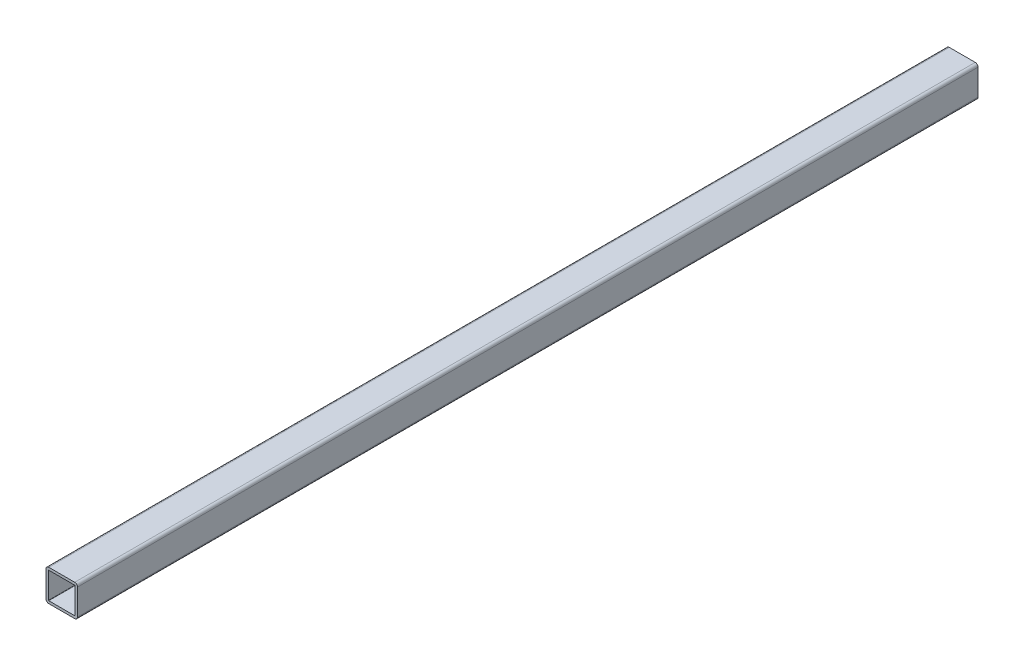
ISO-10303-21;
HEADER;
FILE_DESCRIPTION(('STEP AP214'),'2;1');
FILE_NAME('part.step','',(''),(''),'','','');
FILE_SCHEMA(('AUTOMOTIVE_DESIGN { 1 0 10303 214 1 1 1 1 }'));
ENDSEC;
DATA;
#1=APPLICATION_CONTEXT('core data for automotive mechanical design processes');
#2=APPLICATION_PROTOCOL_DEFINITION('international standard','automotive_design',2000,#1);
#3=PRODUCT_CONTEXT('',#1,'mechanical');
#4=PRODUCT('Part','Part','',(#3));
#5=PRODUCT_RELATED_PRODUCT_CATEGORY('part','',(#4));
#6=PRODUCT_DEFINITION_FORMATION('','',#4);
#7=PRODUCT_DEFINITION_CONTEXT('part definition',#1,'design');
#8=PRODUCT_DEFINITION('design','',#6,#7);
#9=PRODUCT_DEFINITION_SHAPE('','',#8);
#10=(LENGTH_UNIT() NAMED_UNIT(*) SI_UNIT(.MILLI.,.METRE.));
#11=(NAMED_UNIT(*) PLANE_ANGLE_UNIT() SI_UNIT($,.RADIAN.));
#12=(NAMED_UNIT(*) SI_UNIT($,.STERADIAN.) SOLID_ANGLE_UNIT());
#13=UNCERTAINTY_MEASURE_WITH_UNIT(LENGTH_MEASURE(1.E-05),#10,'distance_accuracy_value','');
#14=(GEOMETRIC_REPRESENTATION_CONTEXT(3) GLOBAL_UNCERTAINTY_ASSIGNED_CONTEXT((#13)) GLOBAL_UNIT_ASSIGNED_CONTEXT((#10,
#11,#12)) REPRESENTATION_CONTEXT('',''));
#15=CARTESIAN_POINT('',(0.,0.,0.));
#16=DIRECTION('',(0.,0.,1.));
#17=DIRECTION('',(1.,0.,0.));
#18=AXIS2_PLACEMENT_3D('',#15,#16,#17);
#19=CARTESIAN_POINT('',(-10.3,10.3,-715.));
#20=DIRECTION('',(0.,0.,1.));
#21=DIRECTION('',(1.,0.,0.));
#22=AXIS2_PLACEMENT_3D('',#19,#20,#21);
#23=CYLINDRICAL_SURFACE('',#22,2.2);
#24=CARTESIAN_POINT('',(-10.3,10.3,0.));
#25=DIRECTION('',(0.,0.,-1.));
#26=DIRECTION('',(-1.,0.,0.));
#27=AXIS2_PLACEMENT_3D('',#24,#25,#26);
#28=CIRCLE('',#27,2.2);
#29=CARTESIAN_POINT('',(-12.5,10.3,0.));
#30=VERTEX_POINT('',#29);
#31=CARTESIAN_POINT('',(-10.3,12.5,0.));
#32=VERTEX_POINT('',#31);
#33=EDGE_CURVE('E233',#30,#32,#28,.T.);
#34=ORIENTED_EDGE('',*,*,#33,.T.);
#35=DIRECTION('',(0.,0.,1.));
#36=VECTOR('',#35,1.);
#37=CARTESIAN_POINT('',(-10.3,12.5,-715.));
#38=LINE('',#37,#36);
#39=CARTESIAN_POINT('',(-10.3,12.5,-715.));
#40=VERTEX_POINT('',#39);
#41=EDGE_CURVE('E12',#40,#32,#38,.T.);
#42=ORIENTED_EDGE('',*,*,#41,.F.);
#43=CARTESIAN_POINT('',(-10.3,10.3,-715.));
#44=DIRECTION('',(0.,0.,-1.));
#45=DIRECTION('',(-1.,0.,0.));
#46=AXIS2_PLACEMENT_3D('',#43,#44,#45);
#47=CIRCLE('',#46,2.2);
#48=CARTESIAN_POINT('',(-12.5,10.3,-715.));
#49=VERTEX_POINT('',#48);
#50=EDGE_CURVE('E311',#49,#40,#47,.T.);
#51=ORIENTED_EDGE('',*,*,#50,.F.);
#52=DIRECTION('',(0.,0.,1.));
#53=VECTOR('',#52,1.);
#54=CARTESIAN_POINT('',(-12.5,10.3,-715.));
#55=LINE('',#54,#53);
#56=EDGE_CURVE('E248',#49,#30,#55,.T.);
#57=ORIENTED_EDGE('',*,*,#56,.T.);
#58=EDGE_LOOP('',(#34,#42,#51,#57));
#59=FACE_BOUND('',#58,.T.);
#60=ADVANCED_FACE('F61',(#59),#23,.T.);
#61=CARTESIAN_POINT('',(-10.3,12.5,-715.));
#62=DIRECTION('',(0.,-1.,0.));
#63=DIRECTION('',(0.,0.,-1.));
#64=AXIS2_PLACEMENT_3D('',#61,#62,#63);
#65=PLANE('',#64);
#66=DIRECTION('',(1.,0.,0.));
#67=VECTOR('',#66,1.);
#68=CARTESIAN_POINT('',(-10.3,12.5,0.));
#69=LINE('',#68,#67);
#70=CARTESIAN_POINT('',(10.3,12.5,0.));
#71=VERTEX_POINT('',#70);
#72=EDGE_CURVE('E236',#32,#71,#69,.T.);
#73=ORIENTED_EDGE('',*,*,#72,.T.);
#74=DIRECTION('',(0.,0.,1.));
#75=VECTOR('',#74,1.);
#76=CARTESIAN_POINT('',(10.3,12.5,-715.));
#77=LINE('',#76,#75);
#78=CARTESIAN_POINT('',(10.3,12.5,-715.));
#79=VERTEX_POINT('',#78);
#80=EDGE_CURVE('E71',#79,#71,#77,.T.);
#81=ORIENTED_EDGE('',*,*,#80,.F.);
#82=DIRECTION('',(1.,0.,0.));
#83=VECTOR('',#82,1.);
#84=CARTESIAN_POINT('',(-10.3,12.5,-715.));
#85=LINE('',#84,#83);
#86=EDGE_CURVE('E313',#40,#79,#85,.T.);
#87=ORIENTED_EDGE('',*,*,#86,.F.);
#88=ORIENTED_EDGE('',*,*,#41,.T.);
#89=EDGE_LOOP('',(#73,#81,#87,#88));
#90=FACE_BOUND('',#89,.T.);
#91=ADVANCED_FACE('F348',(#90),#65,.F.);
#92=CARTESIAN_POINT('',(10.3,10.3,-715.));
#93=DIRECTION('',(0.,0.,1.));
#94=DIRECTION('',(1.,0.,0.));
#95=AXIS2_PLACEMENT_3D('',#92,#93,#94);
#96=CYLINDRICAL_SURFACE('',#95,2.2);
#97=CARTESIAN_POINT('',(10.3,10.3,0.));
#98=DIRECTION('',(0.,0.,-1.));
#99=DIRECTION('',(-1.,0.,0.));
#100=AXIS2_PLACEMENT_3D('',#97,#98,#99);
#101=CIRCLE('',#100,2.2);
#102=CARTESIAN_POINT('',(12.5,10.3,0.));
#103=VERTEX_POINT('',#102);
#104=EDGE_CURVE('E238',#71,#103,#101,.T.);
#105=ORIENTED_EDGE('',*,*,#104,.T.);
#106=DIRECTION('',(0.,0.,1.));
#107=VECTOR('',#106,1.);
#108=CARTESIAN_POINT('',(12.5,10.3,-715.));
#109=LINE('',#108,#107);
#110=CARTESIAN_POINT('',(12.5,10.3,-715.));
#111=VERTEX_POINT('',#110);
#112=EDGE_CURVE('E255',#111,#103,#109,.T.);
#113=ORIENTED_EDGE('',*,*,#112,.F.);
#114=CARTESIAN_POINT('',(10.3,10.3,-715.));
#115=DIRECTION('',(0.,0.,-1.));
#116=DIRECTION('',(-1.,0.,0.));
#117=AXIS2_PLACEMENT_3D('',#114,#115,#116);
#118=CIRCLE('',#117,2.2);
#119=EDGE_CURVE('E315',#79,#111,#118,.T.);
#120=ORIENTED_EDGE('',*,*,#119,.F.);
#121=ORIENTED_EDGE('',*,*,#80,.T.);
#122=EDGE_LOOP('',(#105,#113,#120,#121));
#123=FACE_BOUND('',#122,.T.);
#124=ADVANCED_FACE('F353',(#123),#96,.T.);
#125=CARTESIAN_POINT('',(12.5,-10.3,-715.));
#126=DIRECTION('',(-1.,0.,0.));
#127=DIRECTION('',(0.,0.,1.));
#128=AXIS2_PLACEMENT_3D('',#125,#126,#127);
#129=PLANE('',#128);
#130=DIRECTION('',(0.,-1.,0.));
#131=VECTOR('',#130,1.);
#132=CARTESIAN_POINT('',(12.5,-10.3,0.));
#133=LINE('',#132,#131);
#134=CARTESIAN_POINT('',(12.5,-10.3,0.));
#135=VERTEX_POINT('',#134);
#136=EDGE_CURVE('E240',#103,#135,#133,.T.);
#137=ORIENTED_EDGE('',*,*,#136,.T.);
#138=DIRECTION('',(0.,0.,1.));
#139=VECTOR('',#138,1.);
#140=CARTESIAN_POINT('',(12.5,-10.3,-715.));
#141=LINE('',#140,#139);
#142=CARTESIAN_POINT('',(12.5,-10.3,-715.));
#143=VERTEX_POINT('',#142);
#144=EDGE_CURVE('E252',#143,#135,#141,.T.);
#145=ORIENTED_EDGE('',*,*,#144,.F.);
#146=DIRECTION('',(0.,-1.,0.));
#147=VECTOR('',#146,1.);
#148=CARTESIAN_POINT('',(12.5,-10.3,-715.));
#149=LINE('',#148,#147);
#150=EDGE_CURVE('E317',#111,#143,#149,.T.);
#151=ORIENTED_EDGE('',*,*,#150,.F.);
#152=ORIENTED_EDGE('',*,*,#112,.T.);
#153=EDGE_LOOP('',(#137,#145,#151,#152));
#154=FACE_BOUND('',#153,.T.);
#155=ADVANCED_FACE('F323',(#154),#129,.F.);
#156=CARTESIAN_POINT('',(10.3,-10.3,-715.));
#157=DIRECTION('',(0.,0.,1.));
#158=DIRECTION('',(1.,0.,0.));
#159=AXIS2_PLACEMENT_3D('',#156,#157,#158);
#160=CYLINDRICAL_SURFACE('',#159,2.2);
#161=CARTESIAN_POINT('',(10.3,-10.3,0.));
#162=DIRECTION('',(0.,0.,-1.));
#163=DIRECTION('',(-1.,0.,0.));
#164=AXIS2_PLACEMENT_3D('',#161,#162,#163);
#165=CIRCLE('',#164,2.2);
#166=CARTESIAN_POINT('',(10.3,-12.5,0.));
#167=VERTEX_POINT('',#166);
#168=EDGE_CURVE('E242',#135,#167,#165,.T.);
#169=ORIENTED_EDGE('',*,*,#168,.T.);
#170=DIRECTION('',(0.,0.,1.));
#171=VECTOR('',#170,1.);
#172=CARTESIAN_POINT('',(10.3,-12.5,-715.));
#173=LINE('',#172,#171);
#174=CARTESIAN_POINT('',(10.3,-12.5,-715.));
#175=VERTEX_POINT('',#174);
#176=EDGE_CURVE('E200',#175,#167,#173,.T.);
#177=ORIENTED_EDGE('',*,*,#176,.F.);
#178=CARTESIAN_POINT('',(10.3,-10.3,-715.));
#179=DIRECTION('',(0.,0.,-1.));
#180=DIRECTION('',(-1.,0.,0.));
#181=AXIS2_PLACEMENT_3D('',#178,#179,#180);
#182=CIRCLE('',#181,2.2);
#183=EDGE_CURVE('E191',#143,#175,#182,.T.);
#184=ORIENTED_EDGE('',*,*,#183,.F.);
#185=ORIENTED_EDGE('',*,*,#144,.T.);
#186=EDGE_LOOP('',(#169,#177,#184,#185));
#187=FACE_BOUND('',#186,.T.);
#188=ADVANCED_FACE('F327',(#187),#160,.T.);
#189=CARTESIAN_POINT('',(10.3,-12.5,-715.));
#190=DIRECTION('',(0.,1.,0.));
#191=DIRECTION('',(0.,0.,1.));
#192=AXIS2_PLACEMENT_3D('',#189,#190,#191);
#193=PLANE('',#192);
#194=DIRECTION('',(-1.,0.,0.));
#195=VECTOR('',#194,1.);
#196=CARTESIAN_POINT('',(10.3,-12.5,0.));
#197=LINE('',#196,#195);
#198=CARTESIAN_POINT('',(-10.3,-12.5,0.));
#199=VERTEX_POINT('',#198);
#200=EDGE_CURVE('E199',#167,#199,#197,.T.);
#201=ORIENTED_EDGE('',*,*,#200,.T.);
#202=DIRECTION('',(0.,0.,1.));
#203=VECTOR('',#202,1.);
#204=CARTESIAN_POINT('',(-10.3,-12.5,-715.));
#205=LINE('',#204,#203);
#206=CARTESIAN_POINT('',(-10.3,-12.5,-715.));
#207=VERTEX_POINT('',#206);
#208=EDGE_CURVE('E196',#207,#199,#205,.T.);
#209=ORIENTED_EDGE('',*,*,#208,.F.);
#210=DIRECTION('',(-1.,0.,0.));
#211=VECTOR('',#210,1.);
#212=CARTESIAN_POINT('',(10.3,-12.5,-715.));
#213=LINE('',#212,#211);
#214=EDGE_CURVE('E185',#175,#207,#213,.T.);
#215=ORIENTED_EDGE('',*,*,#214,.F.);
#216=ORIENTED_EDGE('',*,*,#176,.T.);
#217=EDGE_LOOP('',(#201,#209,#215,#216));
#218=FACE_BOUND('',#217,.T.);
#219=ADVANCED_FACE('F197',(#218),#193,.F.);
#220=CARTESIAN_POINT('',(-10.3,-10.3,-715.));
#221=DIRECTION('',(0.,0.,1.));
#222=DIRECTION('',(1.,0.,0.));
#223=AXIS2_PLACEMENT_3D('',#220,#221,#222);
#224=CYLINDRICAL_SURFACE('',#223,2.2);
#225=CARTESIAN_POINT('',(-10.3,-10.3,0.));
#226=DIRECTION('',(0.,0.,-1.));
#227=DIRECTION('',(-1.,0.,0.));
#228=AXIS2_PLACEMENT_3D('',#225,#226,#227);
#229=CIRCLE('',#228,2.2);
#230=CARTESIAN_POINT('',(-12.5,-10.3,0.));
#231=VERTEX_POINT('',#230);
#232=EDGE_CURVE('E133',#199,#231,#229,.T.);
#233=ORIENTED_EDGE('',*,*,#232,.T.);
#234=DIRECTION('',(0.,0.,1.));
#235=VECTOR('',#234,1.);
#236=CARTESIAN_POINT('',(-12.5,-10.3,-715.));
#237=LINE('',#236,#235);
#238=CARTESIAN_POINT('',(-12.5,-10.3,-715.));
#239=VERTEX_POINT('',#238);
#240=EDGE_CURVE('E201',#239,#231,#237,.T.);
#241=ORIENTED_EDGE('',*,*,#240,.F.);
#242=CARTESIAN_POINT('',(-10.3,-10.3,-715.));
#243=DIRECTION('',(0.,0.,-1.));
#244=DIRECTION('',(-1.,0.,0.));
#245=AXIS2_PLACEMENT_3D('',#242,#243,#244);
#246=CIRCLE('',#245,2.2);
#247=EDGE_CURVE('E189',#207,#239,#246,.T.);
#248=ORIENTED_EDGE('',*,*,#247,.F.);
#249=ORIENTED_EDGE('',*,*,#208,.T.);
#250=EDGE_LOOP('',(#233,#241,#248,#249));
#251=FACE_BOUND('',#250,.T.);
#252=ADVANCED_FACE('F203',(#251),#224,.T.);
#253=CARTESIAN_POINT('',(10.3,10.3,-715.));
#254=DIRECTION('',(0.,0.,1.));
#255=DIRECTION('',(1.,0.,0.));
#256=AXIS2_PLACEMENT_3D('',#253,#254,#255);
#257=CYLINDRICAL_SURFACE('',#256,0.200000000000001);
#258=CARTESIAN_POINT('',(10.3,10.3,0.));
#259=DIRECTION('',(0.,0.,-1.));
#260=DIRECTION('',(-1.,0.,0.));
#261=AXIS2_PLACEMENT_3D('',#258,#259,#260);
#262=CIRCLE('',#261,0.200000000000001);
#263=CARTESIAN_POINT('',(10.3,10.5,0.));
#264=VERTEX_POINT('',#263);
#265=CARTESIAN_POINT('',(10.5,10.3,0.));
#266=VERTEX_POINT('',#265);
#267=EDGE_CURVE('E209',#264,#266,#262,.T.);
#268=ORIENTED_EDGE('',*,*,#267,.F.);
#269=DIRECTION('',(0.,0.,1.));
#270=VECTOR('',#269,1.);
#271=CARTESIAN_POINT('',(10.3,10.5,-715.));
#272=LINE('',#271,#270);
#273=CARTESIAN_POINT('',(10.3,10.5,-715.));
#274=VERTEX_POINT('',#273);
#275=EDGE_CURVE('E65',#274,#264,#272,.T.);
#276=ORIENTED_EDGE('',*,*,#275,.F.);
#277=CARTESIAN_POINT('',(10.3,10.3,-715.));
#278=DIRECTION('',(0.,0.,-1.));
#279=DIRECTION('',(-1.,0.,0.));
#280=AXIS2_PLACEMENT_3D('',#277,#278,#279);
#281=CIRCLE('',#280,0.200000000000001);
#282=CARTESIAN_POINT('',(10.5,10.3,-715.));
#283=VERTEX_POINT('',#282);
#284=EDGE_CURVE('E247',#274,#283,#281,.T.);
#285=ORIENTED_EDGE('',*,*,#284,.T.);
#286=DIRECTION('',(0.,0.,1.));
#287=VECTOR('',#286,1.);
#288=CARTESIAN_POINT('',(10.5,10.3,-715.));
#289=LINE('',#288,#287);
#290=EDGE_CURVE('E205',#283,#266,#289,.T.);
#291=ORIENTED_EDGE('',*,*,#290,.T.);
#292=EDGE_LOOP('',(#268,#276,#285,#291));
#293=FACE_BOUND('',#292,.T.);
#294=ADVANCED_FACE('F63',(#293),#257,.F.);
#295=CARTESIAN_POINT('',(-10.3,10.5,-715.));
#296=DIRECTION('',(0.,-1.,0.));
#297=DIRECTION('',(0.,0.,-1.));
#298=AXIS2_PLACEMENT_3D('',#295,#296,#297);
#299=PLANE('',#298);
#300=DIRECTION('',(1.,0.,0.));
#301=VECTOR('',#300,1.);
#302=CARTESIAN_POINT('',(-10.3,10.5,0.));
#303=LINE('',#302,#301);
#304=CARTESIAN_POINT('',(-10.3,10.5,0.));
#305=VERTEX_POINT('',#304);
#306=EDGE_CURVE('E212',#305,#264,#303,.T.);
#307=ORIENTED_EDGE('',*,*,#306,.F.);
#308=DIRECTION('',(0.,0.,1.));
#309=VECTOR('',#308,1.);
#310=CARTESIAN_POINT('',(-10.3,10.5,-715.));
#311=LINE('',#310,#309);
#312=CARTESIAN_POINT('',(-10.3,10.5,-715.));
#313=VERTEX_POINT('',#312);
#314=EDGE_CURVE('E270',#313,#305,#311,.T.);
#315=ORIENTED_EDGE('',*,*,#314,.F.);
#316=DIRECTION('',(1.,0.,0.));
#317=VECTOR('',#316,1.);
#318=CARTESIAN_POINT('',(-10.3,10.5,-715.));
#319=LINE('',#318,#317);
#320=EDGE_CURVE('E279',#313,#274,#319,.T.);
#321=ORIENTED_EDGE('',*,*,#320,.T.);
#322=ORIENTED_EDGE('',*,*,#275,.T.);
#323=EDGE_LOOP('',(#307,#315,#321,#322));
#324=FACE_BOUND('',#323,.T.);
#325=ADVANCED_FACE('F277',(#324),#299,.T.);
#326=CARTESIAN_POINT('',(-10.3,10.3,-715.));
#327=DIRECTION('',(0.,0.,1.));
#328=DIRECTION('',(1.,0.,0.));
#329=AXIS2_PLACEMENT_3D('',#326,#327,#328);
#330=CYLINDRICAL_SURFACE('',#329,0.2);
#331=CARTESIAN_POINT('',(-10.3,10.3,0.));
#332=DIRECTION('',(0.,0.,-1.));
#333=DIRECTION('',(-1.,0.,0.));
#334=AXIS2_PLACEMENT_3D('',#331,#332,#333);
#335=CIRCLE('',#334,0.2);
#336=CARTESIAN_POINT('',(-10.5,10.3,0.));
#337=VERTEX_POINT('',#336);
#338=EDGE_CURVE('E215',#337,#305,#335,.T.);
#339=ORIENTED_EDGE('',*,*,#338,.F.);
#340=DIRECTION('',(0.,0.,1.));
#341=VECTOR('',#340,1.);
#342=CARTESIAN_POINT('',(-10.5,10.3,-715.));
#343=LINE('',#342,#341);
#344=CARTESIAN_POINT('',(-10.5,10.3,-715.));
#345=VERTEX_POINT('',#344);
#346=EDGE_CURVE('E269',#345,#337,#343,.T.);
#347=ORIENTED_EDGE('',*,*,#346,.F.);
#348=CARTESIAN_POINT('',(-10.3,10.3,-715.));
#349=DIRECTION('',(0.,0.,-1.));
#350=DIRECTION('',(-1.,0.,0.));
#351=AXIS2_PLACEMENT_3D('',#348,#349,#350);
#352=CIRCLE('',#351,0.2);
#353=EDGE_CURVE('E287',#345,#313,#352,.T.);
#354=ORIENTED_EDGE('',*,*,#353,.T.);
#355=ORIENTED_EDGE('',*,*,#314,.T.);
#356=EDGE_LOOP('',(#339,#347,#354,#355));
#357=FACE_BOUND('',#356,.T.);
#358=ADVANCED_FACE('F285',(#357),#330,.F.);
#359=CARTESIAN_POINT('',(-10.5,10.3,-715.));
#360=DIRECTION('',(1.,0.,0.));
#361=DIRECTION('',(0.,0.,-1.));
#362=AXIS2_PLACEMENT_3D('',#359,#360,#361);
#363=PLANE('',#362);
#364=DIRECTION('',(0.,1.,0.));
#365=VECTOR('',#364,1.);
#366=CARTESIAN_POINT('',(-10.5,10.3,0.));
#367=LINE('',#366,#365);
#368=CARTESIAN_POINT('',(-10.5,-10.3,0.));
#369=VERTEX_POINT('',#368);
#370=EDGE_CURVE('E218',#369,#337,#367,.T.);
#371=ORIENTED_EDGE('',*,*,#370,.F.);
#372=DIRECTION('',(0.,0.,1.));
#373=VECTOR('',#372,1.);
#374=CARTESIAN_POINT('',(-10.5,-10.3,-715.));
#375=LINE('',#374,#373);
#376=CARTESIAN_POINT('',(-10.5,-10.3,-715.));
#377=VERTEX_POINT('',#376);
#378=EDGE_CURVE('E267',#377,#369,#375,.T.);
#379=ORIENTED_EDGE('',*,*,#378,.F.);
#380=DIRECTION('',(0.,1.,0.));
#381=VECTOR('',#380,1.);
#382=CARTESIAN_POINT('',(-10.5,10.3,-715.));
#383=LINE('',#382,#381);
#384=EDGE_CURVE('E293',#377,#345,#383,.T.);
#385=ORIENTED_EDGE('',*,*,#384,.T.);
#386=ORIENTED_EDGE('',*,*,#346,.T.);
#387=EDGE_LOOP('',(#371,#379,#385,#386));
#388=FACE_BOUND('',#387,.T.);
#389=ADVANCED_FACE('F296',(#388),#363,.T.);
#390=CARTESIAN_POINT('',(-10.3,-10.3,-715.));
#391=DIRECTION('',(0.,0.,1.));
#392=DIRECTION('',(1.,0.,0.));
#393=AXIS2_PLACEMENT_3D('',#390,#391,#392);
#394=CYLINDRICAL_SURFACE('',#393,0.2);
#395=CARTESIAN_POINT('',(-10.3,-10.3,0.));
#396=DIRECTION('',(0.,0.,-1.));
#397=DIRECTION('',(-1.,0.,0.));
#398=AXIS2_PLACEMENT_3D('',#395,#396,#397);
#399=CIRCLE('',#398,0.2);
#400=CARTESIAN_POINT('',(-10.3,-10.5,0.));
#401=VERTEX_POINT('',#400);
#402=EDGE_CURVE('E221',#401,#369,#399,.T.);
#403=ORIENTED_EDGE('',*,*,#402,.F.);
#404=DIRECTION('',(0.,0.,1.));
#405=VECTOR('',#404,1.);
#406=CARTESIAN_POINT('',(-10.3,-10.5,-715.));
#407=LINE('',#406,#405);
#408=CARTESIAN_POINT('',(-10.3,-10.5,-715.));
#409=VERTEX_POINT('',#408);
#410=EDGE_CURVE('E265',#409,#401,#407,.T.);
#411=ORIENTED_EDGE('',*,*,#410,.F.);
#412=CARTESIAN_POINT('',(-10.3,-10.3,-715.));
#413=DIRECTION('',(0.,0.,-1.));
#414=DIRECTION('',(-1.,0.,0.));
#415=AXIS2_PLACEMENT_3D('',#412,#413,#414);
#416=CIRCLE('',#415,0.2);
#417=EDGE_CURVE('E297',#409,#377,#416,.T.);
#418=ORIENTED_EDGE('',*,*,#417,.T.);
#419=ORIENTED_EDGE('',*,*,#378,.T.);
#420=EDGE_LOOP('',(#403,#411,#418,#419));
#421=FACE_BOUND('',#420,.T.);
#422=ADVANCED_FACE('F364',(#421),#394,.F.);
#423=CARTESIAN_POINT('',(10.3,-10.5,-715.));
#424=DIRECTION('',(0.,1.,0.));
#425=DIRECTION('',(0.,0.,1.));
#426=AXIS2_PLACEMENT_3D('',#423,#424,#425);
#427=PLANE('',#426);
#428=DIRECTION('',(-1.,0.,0.));
#429=VECTOR('',#428,1.);
#430=CARTESIAN_POINT('',(10.3,-10.5,0.));
#431=LINE('',#430,#429);
#432=CARTESIAN_POINT('',(10.3,-10.5,0.));
#433=VERTEX_POINT('',#432);
#434=EDGE_CURVE('E224',#433,#401,#431,.T.);
#435=ORIENTED_EDGE('',*,*,#434,.F.);
#436=DIRECTION('',(0.,0.,1.));
#437=VECTOR('',#436,1.);
#438=CARTESIAN_POINT('',(10.3,-10.5,-715.));
#439=LINE('',#438,#437);
#440=CARTESIAN_POINT('',(10.3,-10.5,-715.));
#441=VERTEX_POINT('',#440);
#442=EDGE_CURVE('E263',#441,#433,#439,.T.);
#443=ORIENTED_EDGE('',*,*,#442,.F.);
#444=DIRECTION('',(-1.,0.,0.));
#445=VECTOR('',#444,1.);
#446=CARTESIAN_POINT('',(10.3,-10.5,-715.));
#447=LINE('',#446,#445);
#448=EDGE_CURVE('E299',#441,#409,#447,.T.);
#449=ORIENTED_EDGE('',*,*,#448,.T.);
#450=ORIENTED_EDGE('',*,*,#410,.T.);
#451=EDGE_LOOP('',(#435,#443,#449,#450));
#452=FACE_BOUND('',#451,.T.);
#453=ADVANCED_FACE('F360',(#452),#427,.T.);
#454=CARTESIAN_POINT('',(10.3,-10.3,-715.));
#455=DIRECTION('',(0.,0.,1.));
#456=DIRECTION('',(1.,0.,0.));
#457=AXIS2_PLACEMENT_3D('',#454,#455,#456);
#458=CYLINDRICAL_SURFACE('',#457,0.199999999999999);
#459=CARTESIAN_POINT('',(10.3,-10.3,0.));
#460=DIRECTION('',(0.,0.,-1.));
#461=DIRECTION('',(-1.,0.,0.));
#462=AXIS2_PLACEMENT_3D('',#459,#460,#461);
#463=CIRCLE('',#462,0.199999999999999);
#464=CARTESIAN_POINT('',(10.5,-10.3,0.));
#465=VERTEX_POINT('',#464);
#466=EDGE_CURVE('E227',#465,#433,#463,.T.);
#467=ORIENTED_EDGE('',*,*,#466,.F.);
#468=DIRECTION('',(0.,0.,1.));
#469=VECTOR('',#468,1.);
#470=CARTESIAN_POINT('',(10.5,-10.3,-715.));
#471=LINE('',#470,#469);
#472=CARTESIAN_POINT('',(10.5,-10.3,-715.));
#473=VERTEX_POINT('',#472);
#474=EDGE_CURVE('E261',#473,#465,#471,.T.);
#475=ORIENTED_EDGE('',*,*,#474,.F.);
#476=CARTESIAN_POINT('',(10.3,-10.3,-715.));
#477=DIRECTION('',(0.,0.,-1.));
#478=DIRECTION('',(-1.,0.,0.));
#479=AXIS2_PLACEMENT_3D('',#476,#477,#478);
#480=CIRCLE('',#479,0.199999999999999);
#481=EDGE_CURVE('E305',#473,#441,#480,.T.);
#482=ORIENTED_EDGE('',*,*,#481,.T.);
#483=ORIENTED_EDGE('',*,*,#442,.T.);
#484=EDGE_LOOP('',(#467,#475,#482,#483));
#485=FACE_BOUND('',#484,.T.);
#486=ADVANCED_FACE('F342',(#485),#458,.F.);
#487=CARTESIAN_POINT('',(10.5,-10.3,-715.));
#488=DIRECTION('',(-1.,0.,0.));
#489=DIRECTION('',(0.,0.,1.));
#490=AXIS2_PLACEMENT_3D('',#487,#488,#489);
#491=PLANE('',#490);
#492=DIRECTION('',(0.,-1.,0.));
#493=VECTOR('',#492,1.);
#494=CARTESIAN_POINT('',(10.5,-10.3,0.));
#495=LINE('',#494,#493);
#496=EDGE_CURVE('E230',#266,#465,#495,.T.);
#497=ORIENTED_EDGE('',*,*,#496,.F.);
#498=ORIENTED_EDGE('',*,*,#290,.F.);
#499=DIRECTION('',(0.,-1.,0.));
#500=VECTOR('',#499,1.);
#501=CARTESIAN_POINT('',(10.5,-10.3,-715.));
#502=LINE('',#501,#500);
#503=EDGE_CURVE('E308',#283,#473,#502,.T.);
#504=ORIENTED_EDGE('',*,*,#503,.T.);
#505=ORIENTED_EDGE('',*,*,#474,.T.);
#506=EDGE_LOOP('',(#497,#498,#504,#505));
#507=FACE_BOUND('',#506,.T.);
#508=ADVANCED_FACE('F335',(#507),#491,.T.);
#509=CARTESIAN_POINT('',(-12.5,10.3,-715.));
#510=DIRECTION('',(1.,0.,0.));
#511=DIRECTION('',(0.,0.,-1.));
#512=AXIS2_PLACEMENT_3D('',#509,#510,#511);
#513=PLANE('',#512);
#514=DIRECTION('',(0.,1.,0.));
#515=VECTOR('',#514,1.);
#516=CARTESIAN_POINT('',(-12.5,10.3,0.));
#517=LINE('',#516,#515);
#518=EDGE_CURVE('E139',#231,#30,#517,.T.);
#519=ORIENTED_EDGE('',*,*,#518,.T.);
#520=ORIENTED_EDGE('',*,*,#56,.F.);
#521=DIRECTION('',(0.,1.,0.));
#522=VECTOR('',#521,1.);
#523=CARTESIAN_POINT('',(-12.5,10.3,-715.));
#524=LINE('',#523,#522);
#525=EDGE_CURVE('E80',#239,#49,#524,.T.);
#526=ORIENTED_EDGE('',*,*,#525,.F.);
#527=ORIENTED_EDGE('',*,*,#240,.T.);
#528=EDGE_LOOP('',(#519,#520,#526,#527));
#529=FACE_BOUND('',#528,.T.);
#530=ADVANCED_FACE('F333',(#529),#513,.F.);
#531=CARTESIAN_POINT('',(-10.3,10.3,-715.));
#532=DIRECTION('',(0.,0.,-1.));
#533=DIRECTION('',(-1.,0.,0.));
#534=AXIS2_PLACEMENT_3D('',#531,#532,#533);
#535=PLANE('',#534);
#536=ORIENTED_EDGE('',*,*,#284,.F.);
#537=ORIENTED_EDGE('',*,*,#320,.F.);
#538=ORIENTED_EDGE('',*,*,#353,.F.);
#539=ORIENTED_EDGE('',*,*,#384,.F.);
#540=ORIENTED_EDGE('',*,*,#417,.F.);
#541=ORIENTED_EDGE('',*,*,#448,.F.);
#542=ORIENTED_EDGE('',*,*,#481,.F.);
#543=ORIENTED_EDGE('',*,*,#503,.F.);
#544=EDGE_LOOP('',(#536,#537,#538,#539,#540,#541,#542,#543));
#545=FACE_BOUND('',#544,.T.);
#546=ORIENTED_EDGE('',*,*,#50,.T.);
#547=ORIENTED_EDGE('',*,*,#86,.T.);
#548=ORIENTED_EDGE('',*,*,#119,.T.);
#549=ORIENTED_EDGE('',*,*,#150,.T.);
#550=ORIENTED_EDGE('',*,*,#183,.T.);
#551=ORIENTED_EDGE('',*,*,#214,.T.);
#552=ORIENTED_EDGE('',*,*,#247,.T.);
#553=ORIENTED_EDGE('',*,*,#525,.T.);
#554=EDGE_LOOP('',(#546,#547,#548,#549,#550,#551,#552,#553));
#555=FACE_BOUND('',#554,.T.);
#556=ADVANCED_FACE('F187',(#545,#555),#535,.T.);
#557=CARTESIAN_POINT('',(-10.3,10.3,0.));
#558=DIRECTION('',(0.,0.,-1.));
#559=DIRECTION('',(-1.,0.,0.));
#560=AXIS2_PLACEMENT_3D('',#557,#558,#559);
#561=PLANE('',#560);
#562=ORIENTED_EDGE('',*,*,#267,.T.);
#563=ORIENTED_EDGE('',*,*,#496,.T.);
#564=ORIENTED_EDGE('',*,*,#466,.T.);
#565=ORIENTED_EDGE('',*,*,#434,.T.);
#566=ORIENTED_EDGE('',*,*,#402,.T.);
#567=ORIENTED_EDGE('',*,*,#370,.T.);
#568=ORIENTED_EDGE('',*,*,#338,.T.);
#569=ORIENTED_EDGE('',*,*,#306,.T.);
#570=EDGE_LOOP('',(#562,#563,#564,#565,#566,#567,#568,#569));
#571=FACE_BOUND('',#570,.T.);
#572=ORIENTED_EDGE('',*,*,#33,.F.);
#573=ORIENTED_EDGE('',*,*,#518,.F.);
#574=ORIENTED_EDGE('',*,*,#232,.F.);
#575=ORIENTED_EDGE('',*,*,#200,.F.);
#576=ORIENTED_EDGE('',*,*,#168,.F.);
#577=ORIENTED_EDGE('',*,*,#136,.F.);
#578=ORIENTED_EDGE('',*,*,#104,.F.);
#579=ORIENTED_EDGE('',*,*,#72,.F.);
#580=EDGE_LOOP('',(#572,#573,#574,#575,#576,#577,#578,#579));
#581=FACE_BOUND('',#580,.T.);
#582=ADVANCED_FACE('F282',(#571,#581),#561,.F.);
#583=CLOSED_SHELL('',(#60,#91,#124,#155,#188,#219,#252,#294,#325,#358,#389,#422,#453,#486,#508,
#530,#556,#582));
#584=MANIFOLD_SOLID_BREP('B2',#583);
#585=ADVANCED_BREP_SHAPE_REPRESENTATION('',(#18,#584),#14);
#586=SHAPE_DEFINITION_REPRESENTATION(#9,#585);
ENDSEC;
END-ISO-10303-21;
